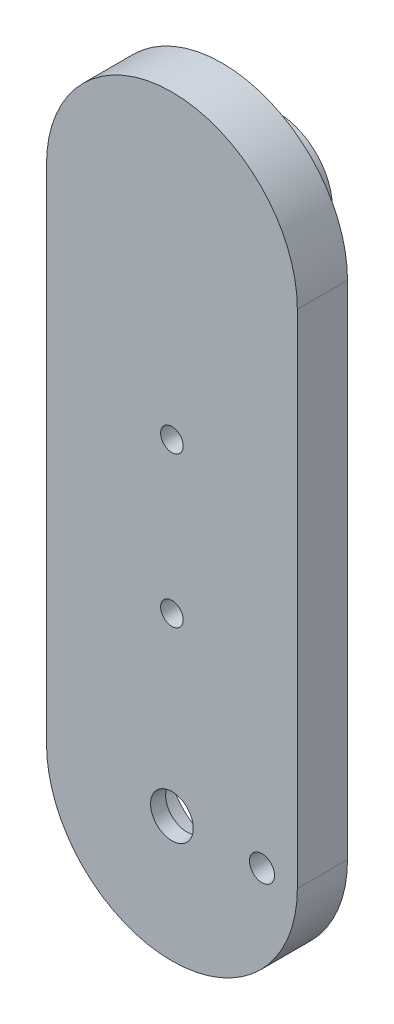
ISO-10303-21;
HEADER;
FILE_DESCRIPTION(('STEP AP214'),'2;1');
FILE_NAME('part.step','',(''),(''),'','','');
FILE_SCHEMA(('AUTOMOTIVE_DESIGN { 1 0 10303 214 1 1 1 1 }'));
ENDSEC;
DATA;
#1=APPLICATION_CONTEXT('core data for automotive mechanical design processes');
#2=APPLICATION_PROTOCOL_DEFINITION('international standard','automotive_design',2000,#1);
#3=PRODUCT_CONTEXT('',#1,'mechanical');
#4=PRODUCT('Part','Part','',(#3));
#5=PRODUCT_RELATED_PRODUCT_CATEGORY('part','',(#4));
#6=PRODUCT_DEFINITION_FORMATION('','',#4);
#7=PRODUCT_DEFINITION_CONTEXT('part definition',#1,'design');
#8=PRODUCT_DEFINITION('design','',#6,#7);
#9=PRODUCT_DEFINITION_SHAPE('','',#8);
#10=(LENGTH_UNIT() NAMED_UNIT(*) SI_UNIT(.MILLI.,.METRE.));
#11=(NAMED_UNIT(*) PLANE_ANGLE_UNIT() SI_UNIT($,.RADIAN.));
#12=(NAMED_UNIT(*) SI_UNIT($,.STERADIAN.) SOLID_ANGLE_UNIT());
#13=UNCERTAINTY_MEASURE_WITH_UNIT(LENGTH_MEASURE(1.E-05),#10,'distance_accuracy_value','');
#14=(GEOMETRIC_REPRESENTATION_CONTEXT(3) GLOBAL_UNCERTAINTY_ASSIGNED_CONTEXT((#13)) GLOBAL_UNIT_ASSIGNED_CONTEXT((#10,
#11,#12)) REPRESENTATION_CONTEXT('',''));
#15=CARTESIAN_POINT('',(0.,0.,0.));
#16=DIRECTION('',(0.,0.,1.));
#17=DIRECTION('',(1.,0.,0.));
#18=AXIS2_PLACEMENT_3D('',#15,#16,#17);
#19=CARTESIAN_POINT('',(0.,0.,5.));
#20=DIRECTION('',(0.,0.,-1.));
#21=DIRECTION('',(-1.,0.,0.));
#22=AXIS2_PLACEMENT_3D('',#19,#20,#21);
#23=CYLINDRICAL_SURFACE('',#22,11.);
#24=CARTESIAN_POINT('',(0.,11.,-2.25));
#25=CARTESIAN_POINT('',(-0.124987608206332,10.9999976894101,-2.24999547473362));
#26=CARTESIAN_POINT('',(-0.250031813618168,10.9978479272228,-2.23955021510708));
#27=CARTESIAN_POINT('',(-0.4965816567914,10.9894795224985,-2.19808072449461));
#28=CARTESIAN_POINT('',(-0.618084473376513,10.9832577238603,-2.16704053079684));
#29=CARTESIAN_POINT('',(-0.853951558981862,10.9674395297871,-2.0853834766751));
#30=CARTESIAN_POINT('',(-0.968322685371622,10.9578464367747,-2.03478576939941));
#31=CARTESIAN_POINT('',(-1.18694541264326,10.9363267475329,-1.91550781782388));
#32=CARTESIAN_POINT('',(-1.29119753484861,10.9244002716133,-1.84682850575217));
#33=CARTESIAN_POINT('',(-1.48810336078442,10.8993365405889,-1.69230825158218));
#34=CARTESIAN_POINT('',(-1.58059347100945,10.8861858654501,-1.60626099838021));
#35=CARTESIAN_POINT('',(-1.74993281237088,10.8602528012969,-1.4198907949013));
#36=CARTESIAN_POINT('',(-1.82678078295885,10.8474704420352,-1.31956669520646));
#37=CARTESIAN_POINT('',(-1.96335672247406,10.8235899485669,-1.10630615387236));
#38=CARTESIAN_POINT('',(-2.02291417693734,10.8125090655011,-0.993258408582383));
#39=CARTESIAN_POINT('',(-2.12212576817039,10.7934772316943,-0.758496098866292));
#40=CARTESIAN_POINT('',(-2.16178196715749,10.7855259566738,-0.636782433917319));
#41=CARTESIAN_POINT('',(-2.21953200261879,10.7737896127739,-0.389906884904544));
#42=CARTESIAN_POINT('',(-2.23791349245955,10.7699490186227,-0.264814983901196));
#43=CARTESIAN_POINT('',(-2.25348602933261,10.7667018443182,-0.0132683424083251));
#44=CARTESIAN_POINT('',(-2.25067934507684,10.7672947894459,0.113186250723861));
#45=CARTESIAN_POINT('',(-2.22418752053513,10.7727972914828,0.361756262662354));
#46=CARTESIAN_POINT('',(-2.20083315981161,10.7776384566947,0.483908675549217));
#47=CARTESIAN_POINT('',(-2.13443150320758,10.7909841309699,0.722524207712961));
#48=CARTESIAN_POINT('',(-2.09138322794608,10.7994888222196,0.838987043727593));
#49=CARTESIAN_POINT('',(-1.98650274323267,10.8192726117414,1.06386523301886));
#50=CARTESIAN_POINT('',(-1.92454034985609,10.8305708318069,1.1722181180589));
#51=CARTESIAN_POINT('',(-1.78368229182678,10.8546565094957,1.37711215490351));
#52=CARTESIAN_POINT('',(-1.70478459548264,10.8674441457167,1.47365188732622));
#53=CARTESIAN_POINT('',(-1.5305292169866,10.8933634351068,1.65408690161898));
#54=CARTESIAN_POINT('',(-1.43488945853772,10.9064970309,1.73770972640525));
#55=CARTESIAN_POINT('',(-1.23079974899386,10.9314081125153,1.88776969690617));
#56=CARTESIAN_POINT('',(-1.12234961883208,10.9431855793768,1.95420660235003));
#57=CARTESIAN_POINT('',(-0.895408008320709,10.9640884212837,2.06806317905267));
#58=CARTESIAN_POINT('',(-0.776899925761593,10.9732092967728,2.11545063663552));
#59=CARTESIAN_POINT('',(-0.533376321976613,10.9877373167415,2.18956691917448));
#60=CARTESIAN_POINT('',(-0.408361628133855,10.9931449321654,2.21629836393965));
#61=CARTESIAN_POINT('',(-0.157713824249075,10.9995712135856,2.24795560381119));
#62=CARTESIAN_POINT('',(-0.0321296514464416,11.0006648863546,2.25325409687552));
#63=CARTESIAN_POINT('',(0.218129471960908,10.9985488283895,2.24290026735251));
#64=CARTESIAN_POINT('',(0.342804475702921,10.9953393512174,2.22724917921333));
#65=CARTESIAN_POINT('',(0.586496202483617,10.985024643941,2.17574997889453));
#66=CARTESIAN_POINT('',(0.70555525804705,10.9779565099984,2.14009409872879));
#67=CARTESIAN_POINT('',(0.936004353214607,10.9607144170942,2.04980829192146));
#68=CARTESIAN_POINT('',(1.04739379805464,10.9505402175947,1.99517689574503));
#69=CARTESIAN_POINT('',(1.26090635939166,10.9280281215346,1.86769158103942));
#70=CARTESIAN_POINT('',(1.36289347169275,10.9156643309935,1.79461455291609));
#71=CARTESIAN_POINT('',(1.55329108640801,10.8902034029711,1.63260992526514));
#72=CARTESIAN_POINT('',(1.64170005931954,10.8771061830993,1.54368054249132));
#73=CARTESIAN_POINT('',(1.80387851970133,10.8514002190471,1.35079560302232));
#74=CARTESIAN_POINT('',(1.87739160405016,10.8388026194027,1.24662271525508));
#75=CARTESIAN_POINT('',(2.00587780786323,10.8157631505878,1.02718877092705));
#76=CARTESIAN_POINT('',(2.06085168612401,10.8053211931951,0.911928168426778));
#77=CARTESIAN_POINT('',(2.15035410407107,10.7878662903402,0.674182257824817));
#78=CARTESIAN_POINT('',(2.18499109110444,10.7808351919115,0.551739172956791));
#79=CARTESIAN_POINT('',(2.2331630323625,10.7709608861474,0.302610955868324));
#80=CARTESIAN_POINT('',(2.2467008819517,10.7681171042035,0.175926408127365));
#81=CARTESIAN_POINT('',(2.25217927138771,10.7669723424816,-0.0755118449622086));
#82=CARTESIAN_POINT('',(2.24452527407203,10.7685860758331,-0.200256503041909));
#83=CARTESIAN_POINT('',(2.2087348262925,10.7759834143784,-0.446639530735529));
#84=CARTESIAN_POINT('',(2.18059855744083,10.7817669825993,-0.56827792788214));
#85=CARTESIAN_POINT('',(2.10482673161827,10.7968133732455,-0.80472250366001));
#86=CARTESIAN_POINT('',(2.05724308574249,10.8060669278161,-0.919545946184929));
#87=CARTESIAN_POINT('',(1.94397468615884,10.8270155237707,-1.1396423265248));
#88=CARTESIAN_POINT('',(1.87828832622432,10.8387107817811,-1.24491441576027));
#89=CARTESIAN_POINT('',(1.72930364309203,10.8634845308472,-1.44493409063308));
#90=CARTESIAN_POINT('',(1.64571339460863,10.8765838900749,-1.53946169134703));
#91=CARTESIAN_POINT('',(1.46389393425321,10.9025424067376,-1.71328211363874));
#92=CARTESIAN_POINT('',(1.36566135997704,10.9154015082357,-1.79257142635859));
#93=CARTESIAN_POINT('',(1.15604167148323,10.9395982609332,-1.93449387957237));
#94=CARTESIAN_POINT('',(1.0445213268703,10.9509175518103,-1.99693351052365));
#95=CARTESIAN_POINT('',(0.812368101867732,10.9705778750018,-2.10208609060745));
#96=CARTESIAN_POINT('',(0.691743413152428,10.9789215468343,-2.1448165326652));
#97=CARTESIAN_POINT('',(0.475734657643083,10.9901003952756,-2.20121594874028));
#98=CARTESIAN_POINT('',(0.381566702172668,10.993790727549,-2.21947682427493));
#99=CARTESIAN_POINT('',(0.191610215430881,10.9987413736296,-2.24387037498906));
#100=CARTESIAN_POINT('',(0.0958217402787857,11.0000017714135,-2.25000346929513));
#101=CARTESIAN_POINT('',(0.,11.,-2.25));
#102=B_SPLINE_CURVE_WITH_KNOTS('',3,(#24,#25,#26,#27,#28,#29,#30,#31,#32,#33,#34,#35,#36,#37,
#38,#39,#40,#41,#42,#43,#44,#45,#46,#47,#48,#49,#50,#51,#52,#53,#54,#55,#56,#57,#58,#59,#60,#61,
#62,#63,#64,#65,#66,#67,#68,#69,#70,#71,#72,#73,#74,#75,#76,#77,#78,#79,#80,#81,#82,#83,#84,#85,
#86,#87,#88,#89,#90,#91,#92,#93,#94,#95,#96,#97,#98,#99,#100,#101),.UNSPECIFIED.,.T.,.F.,(4,2,2,
2,2,2,2,2,2,2,2,2,2,2,2,2,2,2,2,2,2,2,2,2,2,2,2,2,2,2,2,2,2,2,2,2,2,2,4),(0.,0.37461223356625,
0.749515161123903,1.1240518635786,1.49856925993152,1.87782932107627,2.25711993344849,
2.64003296953064,3.02290631901961,3.4005400613464,3.77813336932442,4.14975711394916,
4.52139934148146,4.89565953664907,5.26996465611624,5.65132097785948,6.03268263093399,
6.41468650194891,6.79664191532833,7.17192618317925,7.547188338484,7.91890477081495,
8.29064999667578,8.6671273197432,9.0436470198529,9.42618108999931,9.80869950139742,
10.1891591427531,10.5695665702982,10.9427462365815,11.3159225939959,11.6881092668619,
12.0603289739308,12.4391557816834,12.8180697160859,13.2011660676324,13.5839217439412,
13.8711281099734,14.1583245502059),.UNSPECIFIED.);
#103=CARTESIAN_POINT('',(0.,11.,-2.25));
#104=VERTEX_POINT('',#103);
#105=EDGE_CURVE('E177',#104,#104,#102,.T.);
#106=ORIENTED_EDGE('',*,*,#105,.F.);
#107=EDGE_LOOP('',(#106));
#108=FACE_BOUND('',#107,.T.);
#109=CARTESIAN_POINT('',(0.,0.,-5.));
#110=DIRECTION('',(0.,0.,1.));
#111=DIRECTION('',(1.,0.,0.));
#112=AXIS2_PLACEMENT_3D('',#109,#110,#111);
#113=CIRCLE('',#112,11.);
#114=CARTESIAN_POINT('',(11.,0.,-5.));
#115=VERTEX_POINT('',#114);
#116=EDGE_CURVE('E201',#115,#115,#113,.T.);
#117=ORIENTED_EDGE('',*,*,#116,.T.);
#118=EDGE_LOOP('',(#117));
#119=FACE_BOUND('',#118,.T.);
#120=CARTESIAN_POINT('',(0.,0.,6.));
#121=DIRECTION('',(0.,0.,1.));
#122=DIRECTION('',(1.,0.,0.));
#123=AXIS2_PLACEMENT_3D('',#120,#121,#122);
#124=CIRCLE('',#123,11.);
#125=CARTESIAN_POINT('',(11.,0.,6.));
#126=VERTEX_POINT('',#125);
#127=EDGE_CURVE('E11',#126,#126,#124,.T.);
#128=ORIENTED_EDGE('',*,*,#127,.F.);
#129=EDGE_LOOP('',(#128));
#130=FACE_BOUND('',#129,.T.);
#131=ADVANCED_FACE('F39',(#108,#119,#130),#23,.T.);
#132=CARTESIAN_POINT('',(0.,0.,5.));
#133=DIRECTION('',(0.,0.,-1.));
#134=DIRECTION('',(-1.,0.,0.));
#135=AXIS2_PLACEMENT_3D('',#132,#133,#134);
#136=CYLINDRICAL_SURFACE('',#135,3.1);
#137=DIRECTION('',(0.,0.,-1.));
#138=VECTOR('',#137,1.);
#139=CARTESIAN_POINT('',(-1.83303027798234,2.5,5.));
#140=LINE('',#139,#138);
#141=CARTESIAN_POINT('',(-1.83303027798234,2.5,-1.30479883506999));
#142=VERTEX_POINT('',#141);
#143=CARTESIAN_POINT('',(-1.83303027798234,2.5,-5.));
#144=VERTEX_POINT('',#143);
#145=EDGE_CURVE('E189',#142,#144,#140,.T.);
#146=ORIENTED_EDGE('',*,*,#145,.F.);
#147=CARTESIAN_POINT('',(-1.83303027798234,2.5,-1.30479883506999));
#148=CARTESIAN_POINT('',(-1.86470626813592,2.47677763485356,-1.26028157910569));
#149=CARTESIAN_POINT('',(-1.89481556700698,2.45377147589371,-1.214567481988));
#150=CARTESIAN_POINT('',(-1.95183424303017,2.40866466730363,-1.12065954838441));
#151=CARTESIAN_POINT('',(-1.97873908587669,2.38656532912035,-1.07246233315638));
#152=CARTESIAN_POINT('',(-2.05495365259588,2.32198480729672,-0.923163435206452));
#153=CARTESIAN_POINT('',(-2.09908718400533,2.2817347156289,-0.818295850085372));
#154=CARTESIAN_POINT('',(-2.16443011816865,2.21965504144289,-0.621479043886192));
#155=CARTESIAN_POINT('',(-2.18845657946295,2.19575243317431,-0.531127565624099));
#156=CARTESIAN_POINT('',(-2.22515395568232,2.15856059263126,-0.346393107468627));
#157=CARTESIAN_POINT('',(-2.23788234035652,2.1452176845517,-0.252033119167112));
#158=CARTESIAN_POINT('',(-2.25123223599405,2.13121196711096,-0.0607776570080386));
#159=CARTESIAN_POINT('',(-2.25176563295208,2.13064144431452,0.0361312079282121));
#160=CARTESIAN_POINT('',(-2.24044477324092,2.14253601676988,0.228530378604305));
#161=CARTESIAN_POINT('',(-2.22856739183459,2.155025446383,0.324017698799983));
#162=CARTESIAN_POINT('',(-2.19077008868224,2.1934760182532,0.52430690746162));
#163=CARTESIAN_POINT('',(-2.16304839464007,2.22114220928698,0.628424969290037));
#164=CARTESIAN_POINT('',(-2.09437148712518,2.28600498857198,0.829098994194227));
#165=CARTESIAN_POINT('',(-2.05339053778167,2.32322008168312,0.925639793461529));
#166=CARTESIAN_POINT('',(-1.98095086503942,2.38473649331686,1.06842557414586));
#167=CARTESIAN_POINT('',(-1.95360624908354,2.407237300777,1.11761924514944));
#168=CARTESIAN_POINT('',(-1.89570770904669,2.45309006115265,1.21321371017028));
#169=CARTESIAN_POINT('',(-1.86517331954822,2.4764363202695,1.25962904845425));
#170=CARTESIAN_POINT('',(-1.83303027798234,2.5,1.30479883506999));
#171=B_SPLINE_CURVE_WITH_KNOTS('',3,(#147,#148,#149,#150,#151,#152,#153,#154,#155,#156,#157,
#158,#159,#160,#161,#162,#163,#164,#165,#166,#167,#168,#169,#170),.UNSPECIFIED.,.F.,.F.,(4,2,2,
2,2,2,2,2,2,2,2,4),(0.,0.178014377291526,0.356277725428494,0.716574603227641,1.00497730383374,
1.29190444200527,1.58090410146075,1.87044320964988,2.20238487123558,2.53497472747496,
2.71668453874547,2.89734039588229),.UNSPECIFIED.);
#172=CARTESIAN_POINT('',(-1.83303027798234,2.5,1.30479883506999));
#173=VERTEX_POINT('',#172);
#174=EDGE_CURVE('E158',#142,#173,#171,.T.);
#175=ORIENTED_EDGE('',*,*,#174,.T.);
#176=CARTESIAN_POINT('',(-1.83303027798234,2.5,5.));
#177=VERTEX_POINT('',#176);
#178=EDGE_CURVE('E194',#177,#173,#140,.T.);
#179=ORIENTED_EDGE('',*,*,#178,.F.);
#180=CARTESIAN_POINT('',(0.,0.,5.));
#181=DIRECTION('',(0.,0.,1.));
#182=DIRECTION('',(1.,0.,0.));
#183=AXIS2_PLACEMENT_3D('',#180,#181,#182);
#184=CIRCLE('',#183,3.1);
#185=CARTESIAN_POINT('',(1.83303027798234,2.5,5.));
#186=VERTEX_POINT('',#185);
#187=EDGE_CURVE('E184',#177,#186,#184,.T.);
#188=ORIENTED_EDGE('',*,*,#187,.T.);
#189=DIRECTION('',(0.,0.,-1.));
#190=VECTOR('',#189,1.);
#191=CARTESIAN_POINT('',(1.83303027798234,2.5,5.));
#192=LINE('',#191,#190);
#193=CARTESIAN_POINT('',(1.83303027798234,2.5,1.30479883506999));
#194=VERTEX_POINT('',#193);
#195=EDGE_CURVE('E198',#186,#194,#192,.T.);
#196=ORIENTED_EDGE('',*,*,#195,.T.);
#197=CARTESIAN_POINT('',(1.83303027798234,2.5,1.30479883506999));
#198=CARTESIAN_POINT('',(1.86470626813592,2.47677763485356,1.26028157910569));
#199=CARTESIAN_POINT('',(1.89481556700698,2.45377147589371,1.214567481988));
#200=CARTESIAN_POINT('',(1.95183424303017,2.40866466730363,1.12065954838441));
#201=CARTESIAN_POINT('',(1.97873908587668,2.38656532912035,1.07246233315638));
#202=CARTESIAN_POINT('',(2.05495365259588,2.32198480729672,0.923163435206453));
#203=CARTESIAN_POINT('',(2.09908718400533,2.2817347156289,0.818295850085372));
#204=CARTESIAN_POINT('',(2.16443011816866,2.21965504144289,0.621479043886193));
#205=CARTESIAN_POINT('',(2.18845657946295,2.19575243317431,0.531127565624099));
#206=CARTESIAN_POINT('',(2.22515395568232,2.15856059263126,0.346393107468627));
#207=CARTESIAN_POINT('',(2.23788234035652,2.1452176845517,0.252033119167113));
#208=CARTESIAN_POINT('',(2.25123223599405,2.13121196711096,0.0607776570080388));
#209=CARTESIAN_POINT('',(2.25176563295208,2.13064144431452,-0.036131207928212));
#210=CARTESIAN_POINT('',(2.24044477324092,2.14253601676988,-0.228530378604305));
#211=CARTESIAN_POINT('',(2.22856739183459,2.15502544638299,-0.324017698799983));
#212=CARTESIAN_POINT('',(2.19077008868225,2.1934760182532,-0.52430690746162));
#213=CARTESIAN_POINT('',(2.16304839464007,2.22114220928697,-0.628424969290037));
#214=CARTESIAN_POINT('',(2.09437148712518,2.28600498857198,-0.829098994194227));
#215=CARTESIAN_POINT('',(2.05339053778167,2.32322008168312,-0.925639793461528));
#216=CARTESIAN_POINT('',(1.98095086503942,2.38473649331685,-1.06842557414586));
#217=CARTESIAN_POINT('',(1.95360624908354,2.407237300777,-1.11761924514944));
#218=CARTESIAN_POINT('',(1.89570770904669,2.45309006115265,-1.21321371017028));
#219=CARTESIAN_POINT('',(1.86517331954822,2.4764363202695,-1.25962904845426));
#220=CARTESIAN_POINT('',(1.83303027798234,2.5,-1.30479883506999));
#221=B_SPLINE_CURVE_WITH_KNOTS('',3,(#197,#198,#199,#200,#201,#202,#203,#204,#205,#206,#207,
#208,#209,#210,#211,#212,#213,#214,#215,#216,#217,#218,#219,#220),.UNSPECIFIED.,.F.,.F.,(4,2,2,
2,2,2,2,2,2,2,2,4),(0.,0.178014377291526,0.356277725428495,0.716574603227641,1.00497730383374,
1.29190444200527,1.58090410146075,1.87044320964989,2.20238487123558,2.53497472747496,
2.71668453874547,2.8973403958823),.UNSPECIFIED.);
#222=CARTESIAN_POINT('',(1.83303027798234,2.5,-1.30479883506999));
#223=VERTEX_POINT('',#222);
#224=EDGE_CURVE('E56',#194,#223,#221,.T.);
#225=ORIENTED_EDGE('',*,*,#224,.T.);
#226=CARTESIAN_POINT('',(1.83303027798234,2.5,-5.));
#227=VERTEX_POINT('',#226);
#228=EDGE_CURVE('E197',#223,#227,#192,.T.);
#229=ORIENTED_EDGE('',*,*,#228,.T.);
#230=CARTESIAN_POINT('',(0.,0.,-5.));
#231=DIRECTION('',(0.,0.,1.));
#232=DIRECTION('',(1.,0.,0.));
#233=AXIS2_PLACEMENT_3D('',#230,#231,#232);
#234=CIRCLE('',#233,3.1);
#235=EDGE_CURVE('E183',#144,#227,#234,.T.);
#236=ORIENTED_EDGE('',*,*,#235,.F.);
#237=EDGE_LOOP('',(#146,#175,#179,#188,#196,#225,#229,#236));
#238=FACE_BOUND('',#237,.T.);
#239=ADVANCED_FACE('F164',(#238),#136,.F.);
#240=CARTESIAN_POINT('',(1.83303027798234,2.5,5.));
#241=DIRECTION('',(0.,-1.,0.));
#242=DIRECTION('',(1.,0.,0.));
#243=AXIS2_PLACEMENT_3D('',#240,#241,#242);
#244=PLANE('',#243);
#245=ORIENTED_EDGE('',*,*,#228,.F.);
#246=CARTESIAN_POINT('',(0.,2.5,0.));
#247=DIRECTION('',(0.,-1.,0.));
#248=DIRECTION('',(1.,0.,0.));
#249=AXIS2_PLACEMENT_3D('',#246,#247,#248);
#250=CIRCLE('',#249,2.25);
#251=EDGE_CURVE('E48',#223,#142,#250,.F.);
#252=ORIENTED_EDGE('',*,*,#251,.T.);
#253=ORIENTED_EDGE('',*,*,#145,.T.);
#254=DIRECTION('',(-1.,0.,0.));
#255=VECTOR('',#254,1.);
#256=CARTESIAN_POINT('',(1.83303027798234,2.5,-5.));
#257=LINE('',#256,#255);
#258=EDGE_CURVE('E187',#227,#144,#257,.T.);
#259=ORIENTED_EDGE('',*,*,#258,.F.);
#260=EDGE_LOOP('',(#245,#252,#253,#259));
#261=FACE_BOUND('',#260,.T.);
#262=ADVANCED_FACE('F256',(#261),#244,.T.);
#263=CARTESIAN_POINT('',(0.,0.,-5.));
#264=DIRECTION('',(0.,0.,1.));
#265=DIRECTION('',(1.,0.,0.));
#266=AXIS2_PLACEMENT_3D('',#263,#264,#265);
#267=PLANE('',#266);
#268=ORIENTED_EDGE('',*,*,#116,.F.);
#269=EDGE_LOOP('',(#268));
#270=FACE_BOUND('',#269,.T.);
#271=ORIENTED_EDGE('',*,*,#235,.T.);
#272=ORIENTED_EDGE('',*,*,#258,.T.);
#273=EDGE_LOOP('',(#271,#272));
#274=FACE_BOUND('',#273,.T.);
#275=ADVANCED_FACE('F401',(#270,#274),#267,.F.);
#276=ORIENTED_EDGE('',*,*,#178,.T.);
#277=EDGE_CURVE('E204',#173,#194,#250,.F.);
#278=ORIENTED_EDGE('',*,*,#277,.T.);
#279=ORIENTED_EDGE('',*,*,#195,.F.);
#280=DIRECTION('',(-1.,0.,0.));
#281=VECTOR('',#280,1.);
#282=CARTESIAN_POINT('',(1.83303027798234,2.5,5.));
#283=LINE('',#282,#281);
#284=EDGE_CURVE('E63',#186,#177,#283,.T.);
#285=ORIENTED_EDGE('',*,*,#284,.T.);
#286=EDGE_LOOP('',(#276,#278,#279,#285));
#287=FACE_BOUND('',#286,.T.);
#288=ADVANCED_FACE('F403',(#287),#244,.T.);
#289=CARTESIAN_POINT('',(0.,0.,5.));
#290=DIRECTION('',(0.,0.,1.));
#291=DIRECTION('',(1.,0.,0.));
#292=AXIS2_PLACEMENT_3D('',#289,#290,#291);
#293=PLANE('',#292);
#294=ORIENTED_EDGE('',*,*,#284,.F.);
#295=ORIENTED_EDGE('',*,*,#187,.F.);
#296=EDGE_LOOP('',(#294,#295));
#297=FACE_BOUND('',#296,.T.);
#298=ADVANCED_FACE('F173',(#297),#293,.F.);
#299=CARTESIAN_POINT('',(0.,11.,0.));
#300=DIRECTION('',(0.,-1.,0.));
#301=DIRECTION('',(0.,0.,-1.));
#302=AXIS2_PLACEMENT_3D('',#299,#300,#301);
#303=CYLINDRICAL_SURFACE('',#302,2.25);
#304=ORIENTED_EDGE('',*,*,#224,.F.);
#305=ORIENTED_EDGE('',*,*,#277,.F.);
#306=ORIENTED_EDGE('',*,*,#174,.F.);
#307=ORIENTED_EDGE('',*,*,#251,.F.);
#308=EDGE_LOOP('',(#304,#305,#306,#307));
#309=FACE_BOUND('',#308,.T.);
#310=ORIENTED_EDGE('',*,*,#105,.T.);
#311=EDGE_LOOP('',(#310));
#312=FACE_BOUND('',#311,.T.);
#313=ADVANCED_FACE('F167',(#309,#312),#303,.F.);
#314=CARTESIAN_POINT('',(0.,0.,16.));
#315=DIRECTION('',(0.,0.,-1.));
#316=DIRECTION('',(-1.,0.,0.));
#317=AXIS2_PLACEMENT_3D('',#314,#315,#316);
#318=CYLINDRICAL_SURFACE('',#317,25.);
#319=DIRECTION('',(0.,0.,-1.));
#320=VECTOR('',#319,1.);
#321=CARTESIAN_POINT('',(25.,0.,16.));
#322=LINE('',#321,#320);
#323=CARTESIAN_POINT('',(25.,0.,16.));
#324=VERTEX_POINT('',#323);
#325=CARTESIAN_POINT('',(25.,0.,6.));
#326=VERTEX_POINT('',#325);
#327=EDGE_CURVE('E111',#324,#326,#322,.T.);
#328=ORIENTED_EDGE('',*,*,#327,.T.);
#329=CARTESIAN_POINT('',(0.,0.,6.));
#330=DIRECTION('',(0.,0.,1.));
#331=DIRECTION('',(1.,0.,0.));
#332=AXIS2_PLACEMENT_3D('',#329,#330,#331);
#333=CIRCLE('',#332,25.);
#334=CARTESIAN_POINT('',(-25.,0.,6.));
#335=VERTEX_POINT('',#334);
#336=EDGE_CURVE('E138',#326,#335,#333,.T.);
#337=ORIENTED_EDGE('',*,*,#336,.T.);
#338=DIRECTION('',(0.,0.,-1.));
#339=VECTOR('',#338,1.);
#340=CARTESIAN_POINT('',(-25.,0.,16.));
#341=LINE('',#340,#339);
#342=CARTESIAN_POINT('',(-25.,0.,16.));
#343=VERTEX_POINT('',#342);
#344=EDGE_CURVE('E149',#343,#335,#341,.T.);
#345=ORIENTED_EDGE('',*,*,#344,.F.);
#346=CARTESIAN_POINT('',(0.,0.,16.));
#347=DIRECTION('',(0.,0.,1.));
#348=DIRECTION('',(1.,0.,0.));
#349=AXIS2_PLACEMENT_3D('',#346,#347,#348);
#350=CIRCLE('',#349,25.);
#351=EDGE_CURVE('E145',#324,#343,#350,.T.);
#352=ORIENTED_EDGE('',*,*,#351,.F.);
#353=EDGE_LOOP('',(#328,#337,#345,#352));
#354=FACE_BOUND('',#353,.T.);
#355=ADVANCED_FACE('F172',(#354),#318,.T.);
#356=CARTESIAN_POINT('',(-25.,0.,16.));
#357=DIRECTION('',(1.,0.,0.));
#358=DIRECTION('',(0.,1.,0.));
#359=AXIS2_PLACEMENT_3D('',#356,#357,#358);
#360=PLANE('',#359);
#361=ORIENTED_EDGE('',*,*,#344,.T.);
#362=DIRECTION('',(0.,-1.,0.));
#363=VECTOR('',#362,1.);
#364=CARTESIAN_POINT('',(-25.,0.,6.));
#365=LINE('',#364,#363);
#366=CARTESIAN_POINT('',(-25.,-100.,6.00000000000001));
#367=VERTEX_POINT('',#366);
#368=EDGE_CURVE('E141',#335,#367,#365,.T.);
#369=ORIENTED_EDGE('',*,*,#368,.T.);
#370=DIRECTION('',(0.,0.,1.));
#371=VECTOR('',#370,1.);
#372=CARTESIAN_POINT('',(-25.,-100.,-58.0312423743285));
#373=LINE('',#372,#371);
#374=CARTESIAN_POINT('',(-25.,-100.,16.));
#375=VERTEX_POINT('',#374);
#376=EDGE_CURVE('E126',#367,#375,#373,.T.);
#377=ORIENTED_EDGE('',*,*,#376,.T.);
#378=DIRECTION('',(0.,-1.,0.));
#379=VECTOR('',#378,1.);
#380=CARTESIAN_POINT('',(-25.,0.,16.));
#381=LINE('',#380,#379);
#382=EDGE_CURVE('E116',#343,#375,#381,.T.);
#383=ORIENTED_EDGE('',*,*,#382,.F.);
#384=EDGE_LOOP('',(#361,#369,#377,#383));
#385=FACE_BOUND('',#384,.T.);
#386=ADVANCED_FACE('F271',(#385),#360,.F.);
#387=CARTESIAN_POINT('',(25.,-85.,16.));
#388=DIRECTION('',(-1.,0.,0.));
#389=DIRECTION('',(0.,-1.,0.));
#390=AXIS2_PLACEMENT_3D('',#387,#388,#389);
#391=PLANE('',#390);
#392=DIRECTION('',(0.,1.,0.));
#393=VECTOR('',#392,1.);
#394=CARTESIAN_POINT('',(25.,-85.,16.));
#395=LINE('',#394,#393);
#396=CARTESIAN_POINT('',(25.,-100.,16.));
#397=VERTEX_POINT('',#396);
#398=EDGE_CURVE('E106',#397,#324,#395,.T.);
#399=ORIENTED_EDGE('',*,*,#398,.F.);
#400=DIRECTION('',(0.,0.,1.));
#401=VECTOR('',#400,1.);
#402=CARTESIAN_POINT('',(25.,-100.,-58.0312423743285));
#403=LINE('',#402,#401);
#404=CARTESIAN_POINT('',(25.,-100.,6.00000000000001));
#405=VERTEX_POINT('',#404);
#406=EDGE_CURVE('E110',#405,#397,#403,.T.);
#407=ORIENTED_EDGE('',*,*,#406,.F.);
#408=DIRECTION('',(0.,1.,0.));
#409=VECTOR('',#408,1.);
#410=CARTESIAN_POINT('',(25.,-85.,6.));
#411=LINE('',#410,#409);
#412=EDGE_CURVE('E143',#405,#326,#411,.T.);
#413=ORIENTED_EDGE('',*,*,#412,.T.);
#414=ORIENTED_EDGE('',*,*,#327,.F.);
#415=EDGE_LOOP('',(#399,#407,#413,#414));
#416=FACE_BOUND('',#415,.T.);
#417=ADVANCED_FACE('F108',(#416),#391,.F.);
#418=CARTESIAN_POINT('',(0.,0.,16.));
#419=DIRECTION('',(0.,0.,1.));
#420=DIRECTION('',(1.,0.,0.));
#421=AXIS2_PLACEMENT_3D('',#418,#419,#420);
#422=PLANE('',#421);
#423=CARTESIAN_POINT('',(17.95,-100.,16.));
#424=DIRECTION('',(0.,0.,1.));
#425=DIRECTION('',(1.,0.,0.));
#426=AXIS2_PLACEMENT_3D('',#423,#424,#425);
#427=CIRCLE('',#426,2.5);
#428=CARTESIAN_POINT('',(20.45,-100.,16.));
#429=VERTEX_POINT('',#428);
#430=EDGE_CURVE('E229',#429,#429,#427,.T.);
#431=ORIENTED_EDGE('',*,*,#430,.F.);
#432=EDGE_LOOP('',(#431));
#433=FACE_BOUND('',#432,.T.);
#434=CARTESIAN_POINT('',(0.,-100.,16.));
#435=DIRECTION('',(0.,0.,-1.));
#436=DIRECTION('',(-1.,0.,0.));
#437=AXIS2_PLACEMENT_3D('',#434,#435,#436);
#438=CIRCLE('',#437,4.25);
#439=CARTESIAN_POINT('',(-4.24999999999999,-100.,16.));
#440=VERTEX_POINT('',#439);
#441=EDGE_CURVE('E221',#440,#440,#438,.T.);
#442=ORIENTED_EDGE('',*,*,#441,.T.);
#443=EDGE_LOOP('',(#442));
#444=FACE_BOUND('',#443,.T.);
#445=CARTESIAN_POINT('',(0.,-35.,16.));
#446=DIRECTION('',(0.,0.,1.));
#447=DIRECTION('',(1.,0.,0.));
#448=AXIS2_PLACEMENT_3D('',#445,#446,#447);
#449=CIRCLE('',#448,2.25);
#450=CARTESIAN_POINT('',(2.25,-35.,16.));
#451=VERTEX_POINT('',#450);
#452=EDGE_CURVE('E207',#451,#451,#449,.T.);
#453=ORIENTED_EDGE('',*,*,#452,.F.);
#454=EDGE_LOOP('',(#453));
#455=FACE_BOUND('',#454,.T.);
#456=CARTESIAN_POINT('',(0.,-65.,16.));
#457=DIRECTION('',(0.,0.,1.));
#458=DIRECTION('',(1.,0.,0.));
#459=AXIS2_PLACEMENT_3D('',#456,#457,#458);
#460=CIRCLE('',#459,2.25);
#461=CARTESIAN_POINT('',(2.25,-65.,16.));
#462=VERTEX_POINT('',#461);
#463=EDGE_CURVE('E211',#462,#462,#460,.T.);
#464=ORIENTED_EDGE('',*,*,#463,.F.);
#465=EDGE_LOOP('',(#464));
#466=FACE_BOUND('',#465,.T.);
#467=ORIENTED_EDGE('',*,*,#351,.T.);
#468=ORIENTED_EDGE('',*,*,#382,.T.);
#469=CARTESIAN_POINT('',(0.,-100.,16.));
#470=DIRECTION('',(0.,0.,1.));
#471=DIRECTION('',(1.,0.,0.));
#472=AXIS2_PLACEMENT_3D('',#469,#470,#471);
#473=CIRCLE('',#472,25.);
#474=EDGE_CURVE('E123',#375,#397,#473,.T.);
#475=ORIENTED_EDGE('',*,*,#474,.T.);
#476=ORIENTED_EDGE('',*,*,#398,.T.);
#477=EDGE_LOOP('',(#467,#468,#475,#476));
#478=FACE_BOUND('',#477,.T.);
#479=ADVANCED_FACE('F128',(#433,#444,#455,#466,#478),#422,.T.);
#480=CARTESIAN_POINT('',(0.,0.,6.));
#481=DIRECTION('',(0.,0.,1.));
#482=DIRECTION('',(1.,0.,0.));
#483=AXIS2_PLACEMENT_3D('',#480,#481,#482);
#484=PLANE('',#483);
#485=CARTESIAN_POINT('',(17.95,-100.,6.));
#486=DIRECTION('',(0.,0.,1.));
#487=DIRECTION('',(1.,0.,0.));
#488=AXIS2_PLACEMENT_3D('',#485,#486,#487);
#489=CIRCLE('',#488,2.5);
#490=CARTESIAN_POINT('',(20.45,-100.,6.));
#491=VERTEX_POINT('',#490);
#492=EDGE_CURVE('E43',#491,#491,#489,.T.);
#493=ORIENTED_EDGE('',*,*,#492,.T.);
#494=EDGE_LOOP('',(#493));
#495=FACE_BOUND('',#494,.T.);
#496=CARTESIAN_POINT('',(0.,-100.,6.));
#497=DIRECTION('',(0.,0.,-1.));
#498=DIRECTION('',(-1.,0.,0.));
#499=AXIS2_PLACEMENT_3D('',#496,#497,#498);
#500=CIRCLE('',#499,10.9);
#501=CARTESIAN_POINT('',(-10.9,-100.,6.));
#502=VERTEX_POINT('',#501);
#503=EDGE_CURVE('E218',#502,#502,#500,.T.);
#504=ORIENTED_EDGE('',*,*,#503,.F.);
#505=EDGE_LOOP('',(#504));
#506=FACE_BOUND('',#505,.T.);
#507=CARTESIAN_POINT('',(0.,-35.,6.));
#508=DIRECTION('',(0.,0.,1.));
#509=DIRECTION('',(1.,0.,0.));
#510=AXIS2_PLACEMENT_3D('',#507,#508,#509);
#511=CIRCLE('',#510,2.25);
#512=CARTESIAN_POINT('',(2.25,-35.,6.));
#513=VERTEX_POINT('',#512);
#514=EDGE_CURVE('E130',#513,#513,#511,.T.);
#515=ORIENTED_EDGE('',*,*,#514,.T.);
#516=EDGE_LOOP('',(#515));
#517=FACE_BOUND('',#516,.T.);
#518=CARTESIAN_POINT('',(0.,-65.,6.));
#519=DIRECTION('',(0.,0.,1.));
#520=DIRECTION('',(1.,0.,0.));
#521=AXIS2_PLACEMENT_3D('',#518,#519,#520);
#522=CIRCLE('',#521,2.25);
#523=CARTESIAN_POINT('',(2.25,-65.,6.));
#524=VERTEX_POINT('',#523);
#525=EDGE_CURVE('E133',#524,#524,#522,.T.);
#526=ORIENTED_EDGE('',*,*,#525,.T.);
#527=EDGE_LOOP('',(#526));
#528=FACE_BOUND('',#527,.T.);
#529=ORIENTED_EDGE('',*,*,#127,.T.);
#530=EDGE_LOOP('',(#529));
#531=FACE_BOUND('',#530,.T.);
#532=ORIENTED_EDGE('',*,*,#336,.F.);
#533=ORIENTED_EDGE('',*,*,#412,.F.);
#534=CARTESIAN_POINT('',(0.,-100.,6.00000000000001));
#535=DIRECTION('',(0.,0.,1.));
#536=DIRECTION('',(1.,0.,0.));
#537=AXIS2_PLACEMENT_3D('',#534,#535,#536);
#538=CIRCLE('',#537,25.);
#539=EDGE_CURVE('E125',#405,#367,#538,.F.);
#540=ORIENTED_EDGE('',*,*,#539,.T.);
#541=ORIENTED_EDGE('',*,*,#368,.F.);
#542=EDGE_LOOP('',(#532,#533,#540,#541));
#543=FACE_BOUND('',#542,.T.);
#544=ADVANCED_FACE('F236',(#495,#506,#517,#528,#531,#543),#484,.F.);
#545=CARTESIAN_POINT('',(0.,-100.,-58.0312423743285));
#546=DIRECTION('',(0.,0.,1.));
#547=DIRECTION('',(1.,0.,0.));
#548=AXIS2_PLACEMENT_3D('',#545,#546,#547);
#549=CYLINDRICAL_SURFACE('',#548,25.);
#550=ORIENTED_EDGE('',*,*,#539,.F.);
#551=ORIENTED_EDGE('',*,*,#406,.T.);
#552=ORIENTED_EDGE('',*,*,#474,.F.);
#553=ORIENTED_EDGE('',*,*,#376,.F.);
#554=EDGE_LOOP('',(#550,#551,#552,#553));
#555=FACE_BOUND('',#554,.T.);
#556=ADVANCED_FACE('F121',(#555),#549,.T.);
#557=CARTESIAN_POINT('',(0.,-65.,-5.));
#558=DIRECTION('',(0.,0.,1.));
#559=DIRECTION('',(1.,0.,0.));
#560=AXIS2_PLACEMENT_3D('',#557,#558,#559);
#561=CYLINDRICAL_SURFACE('',#560,2.25);
#562=CARTESIAN_POINT('',(2.25,-65.,16.));
#563=CARTESIAN_POINT('',(2.25,-65.,15.8958333333333));
#564=CARTESIAN_POINT('',(2.25,-65.,15.7916666666667));
#565=CARTESIAN_POINT('',(2.25,-65.,15.5833333333333));
#566=CARTESIAN_POINT('',(2.25,-65.,15.4791666666667));
#567=CARTESIAN_POINT('',(2.25,-65.,15.2708333333333));
#568=CARTESIAN_POINT('',(2.25,-65.,15.1666666666667));
#569=CARTESIAN_POINT('',(2.25,-65.,14.9583333333333));
#570=CARTESIAN_POINT('',(2.25,-65.,14.8541666666667));
#571=CARTESIAN_POINT('',(2.25,-65.,14.6458333333333));
#572=CARTESIAN_POINT('',(2.25,-65.,14.5416666666667));
#573=CARTESIAN_POINT('',(2.25,-65.,14.3333333333333));
#574=CARTESIAN_POINT('',(2.25,-65.,14.2291666666667));
#575=CARTESIAN_POINT('',(2.25,-65.,14.0208333333333));
#576=CARTESIAN_POINT('',(2.25,-65.,13.9166666666667));
#577=CARTESIAN_POINT('',(2.25,-65.,13.7083333333333));
#578=CARTESIAN_POINT('',(2.25,-65.,13.6041666666667));
#579=CARTESIAN_POINT('',(2.25,-65.,13.3958333333333));
#580=CARTESIAN_POINT('',(2.25,-65.,13.2916666666667));
#581=CARTESIAN_POINT('',(2.25,-65.,13.0833333333333));
#582=CARTESIAN_POINT('',(2.25,-65.,12.9791666666667));
#583=CARTESIAN_POINT('',(2.25,-65.,12.7708333333333));
#584=CARTESIAN_POINT('',(2.25,-65.,12.6666666666667));
#585=CARTESIAN_POINT('',(2.25,-65.,12.4583333333333));
#586=CARTESIAN_POINT('',(2.25,-65.,12.3541666666667));
#587=CARTESIAN_POINT('',(2.25,-65.,12.1458333333333));
#588=CARTESIAN_POINT('',(2.25,-65.,12.0416666666667));
#589=CARTESIAN_POINT('',(2.25,-65.,11.8333333333333));
#590=CARTESIAN_POINT('',(2.25,-65.,11.7291666666667));
#591=CARTESIAN_POINT('',(2.25,-65.,11.5208333333333));
#592=CARTESIAN_POINT('',(2.25,-65.,11.4166666666667));
#593=CARTESIAN_POINT('',(2.25,-65.,11.2083333333333));
#594=CARTESIAN_POINT('',(2.25,-65.,11.1041666666667));
#595=CARTESIAN_POINT('',(2.25,-65.,10.8958333333333));
#596=CARTESIAN_POINT('',(2.25,-65.,10.7916666666667));
#597=CARTESIAN_POINT('',(2.25,-65.,10.5833333333333));
#598=CARTESIAN_POINT('',(2.25,-65.,10.4791666666667));
#599=CARTESIAN_POINT('',(2.25,-65.,10.2708333333333));
#600=CARTESIAN_POINT('',(2.25,-65.,10.1666666666667));
#601=CARTESIAN_POINT('',(2.25,-65.,9.95833333333333));
#602=CARTESIAN_POINT('',(2.25,-65.,9.85416666666667));
#603=CARTESIAN_POINT('',(2.25,-65.,9.64583333333333));
#604=CARTESIAN_POINT('',(2.25,-65.,9.54166666666667));
#605=CARTESIAN_POINT('',(2.25,-65.,9.33333333333333));
#606=CARTESIAN_POINT('',(2.25,-65.,9.22916666666667));
#607=CARTESIAN_POINT('',(2.25,-65.,9.02083333333333));
#608=CARTESIAN_POINT('',(2.25,-65.,8.91666666666667));
#609=CARTESIAN_POINT('',(2.25,-65.,8.70833333333333));
#610=CARTESIAN_POINT('',(2.25,-65.,8.60416666666667));
#611=CARTESIAN_POINT('',(2.25,-65.,8.39583333333333));
#612=CARTESIAN_POINT('',(2.25,-65.,8.29166666666667));
#613=CARTESIAN_POINT('',(2.25,-65.,8.08333333333333));
#614=CARTESIAN_POINT('',(2.25,-65.,7.97916666666667));
#615=CARTESIAN_POINT('',(2.25,-65.,7.77083333333333));
#616=CARTESIAN_POINT('',(2.25,-65.,7.66666666666666));
#617=CARTESIAN_POINT('',(2.25,-65.,7.45833333333333));
#618=CARTESIAN_POINT('',(2.25,-65.,7.35416666666666));
#619=CARTESIAN_POINT('',(2.25,-65.,7.14583333333333));
#620=CARTESIAN_POINT('',(2.25,-65.,7.04166666666666));
#621=CARTESIAN_POINT('',(2.25,-65.,6.83333333333333));
#622=CARTESIAN_POINT('',(2.25,-65.,6.72916666666666));
#623=CARTESIAN_POINT('',(2.25,-65.,6.52083333333333));
#624=CARTESIAN_POINT('',(2.25,-65.,6.41666666666666));
#625=CARTESIAN_POINT('',(2.25,-65.,6.20833333333333));
#626=CARTESIAN_POINT('',(2.25,-65.,6.10416666666666));
#627=CARTESIAN_POINT('',(2.25,-65.,6.));
#628=B_SPLINE_CURVE_WITH_KNOTS('',3,(#562,#563,#564,#565,#566,#567,#568,#569,#570,#571,#572,
#573,#574,#575,#576,#577,#578,#579,#580,#581,#582,#583,#584,#585,#586,#587,#588,#589,#590,#591,
#592,#593,#594,#595,#596,#597,#598,#599,#600,#601,#602,#603,#604,#605,#606,#607,#608,#609,#610,
#611,#612,#613,#614,#615,#616,#617,#618,#619,#620,#621,#622,#623,#624,#625,#626,#627),
.UNSPECIFIED.,.F.,.F.,(4,2,2,2,2,2,2,2,2,2,2,2,2,2,2,2,2,2,2,2,2,2,2,2,2,2,2,2,2,2,2,2,4),(0.,
0.3125,0.625000000000001,0.937500000000001,1.25,1.5625,1.875,2.1875,2.5,2.8125,3.125,3.4375,
3.75,4.0625,4.375,4.6875,5.,5.3125,5.625,5.9375,6.25,6.5625,6.875,7.1875,7.5,7.8125,8.125,
8.4375,8.75,9.0625,9.375,9.6875,10.),.UNSPECIFIED.);
#629=EDGE_CURVE('BSEAM283',#462,#524,#628,.T.);
#630=ORIENTED_EDGE('',*,*,#463,.T.);
#631=ORIENTED_EDGE('',*,*,#525,.F.);
#632=ORIENTED_EDGE('',*,*,#629,.T.);
#633=ORIENTED_EDGE('',*,*,#629,.F.);
#634=EDGE_LOOP('',(#630,#632,#631,#633));
#635=FACE_BOUND('',#634,.T.);
#636=ADVANCED_FACE('F283',(#635),#561,.F.);
#637=CARTESIAN_POINT('',(0.,-35.,-5.));
#638=DIRECTION('',(0.,0.,1.));
#639=DIRECTION('',(1.,0.,0.));
#640=AXIS2_PLACEMENT_3D('',#637,#638,#639);
#641=CYLINDRICAL_SURFACE('',#640,2.25);
#642=CARTESIAN_POINT('',(2.25,-35.,16.));
#643=CARTESIAN_POINT('',(2.25,-35.,15.8958333333333));
#644=CARTESIAN_POINT('',(2.25,-35.,15.7916666666667));
#645=CARTESIAN_POINT('',(2.25,-35.,15.5833333333333));
#646=CARTESIAN_POINT('',(2.25,-35.,15.4791666666667));
#647=CARTESIAN_POINT('',(2.25,-35.,15.2708333333333));
#648=CARTESIAN_POINT('',(2.25,-35.,15.1666666666667));
#649=CARTESIAN_POINT('',(2.25,-35.,14.9583333333333));
#650=CARTESIAN_POINT('',(2.25,-35.,14.8541666666667));
#651=CARTESIAN_POINT('',(2.25,-35.,14.6458333333333));
#652=CARTESIAN_POINT('',(2.25,-35.,14.5416666666667));
#653=CARTESIAN_POINT('',(2.25,-35.,14.3333333333333));
#654=CARTESIAN_POINT('',(2.25,-35.,14.2291666666667));
#655=CARTESIAN_POINT('',(2.25,-35.,14.0208333333333));
#656=CARTESIAN_POINT('',(2.25,-35.,13.9166666666667));
#657=CARTESIAN_POINT('',(2.25,-35.,13.7083333333333));
#658=CARTESIAN_POINT('',(2.25,-35.,13.6041666666667));
#659=CARTESIAN_POINT('',(2.25,-35.,13.3958333333333));
#660=CARTESIAN_POINT('',(2.25,-35.,13.2916666666667));
#661=CARTESIAN_POINT('',(2.25,-35.,13.0833333333333));
#662=CARTESIAN_POINT('',(2.25,-35.,12.9791666666667));
#663=CARTESIAN_POINT('',(2.25,-35.,12.7708333333333));
#664=CARTESIAN_POINT('',(2.25,-35.,12.6666666666667));
#665=CARTESIAN_POINT('',(2.25,-35.,12.4583333333333));
#666=CARTESIAN_POINT('',(2.25,-35.,12.3541666666667));
#667=CARTESIAN_POINT('',(2.25,-35.,12.1458333333333));
#668=CARTESIAN_POINT('',(2.25,-35.,12.0416666666667));
#669=CARTESIAN_POINT('',(2.25,-35.,11.8333333333333));
#670=CARTESIAN_POINT('',(2.25,-35.,11.7291666666667));
#671=CARTESIAN_POINT('',(2.25,-35.,11.5208333333333));
#672=CARTESIAN_POINT('',(2.25,-35.,11.4166666666667));
#673=CARTESIAN_POINT('',(2.25,-35.,11.2083333333333));
#674=CARTESIAN_POINT('',(2.25,-35.,11.1041666666667));
#675=CARTESIAN_POINT('',(2.25,-35.,10.8958333333333));
#676=CARTESIAN_POINT('',(2.25,-35.,10.7916666666667));
#677=CARTESIAN_POINT('',(2.25,-35.,10.5833333333333));
#678=CARTESIAN_POINT('',(2.25,-35.,10.4791666666667));
#679=CARTESIAN_POINT('',(2.25,-35.,10.2708333333333));
#680=CARTESIAN_POINT('',(2.25,-35.,10.1666666666667));
#681=CARTESIAN_POINT('',(2.25,-35.,9.95833333333333));
#682=CARTESIAN_POINT('',(2.25,-35.,9.85416666666667));
#683=CARTESIAN_POINT('',(2.25,-35.,9.64583333333333));
#684=CARTESIAN_POINT('',(2.25,-35.,9.54166666666667));
#685=CARTESIAN_POINT('',(2.25,-35.,9.33333333333333));
#686=CARTESIAN_POINT('',(2.25,-35.,9.22916666666667));
#687=CARTESIAN_POINT('',(2.25,-35.,9.02083333333333));
#688=CARTESIAN_POINT('',(2.25,-35.,8.91666666666667));
#689=CARTESIAN_POINT('',(2.25,-35.,8.70833333333333));
#690=CARTESIAN_POINT('',(2.25,-35.,8.60416666666667));
#691=CARTESIAN_POINT('',(2.25,-35.,8.39583333333333));
#692=CARTESIAN_POINT('',(2.25,-35.,8.29166666666667));
#693=CARTESIAN_POINT('',(2.25,-35.,8.08333333333333));
#694=CARTESIAN_POINT('',(2.25,-35.,7.97916666666667));
#695=CARTESIAN_POINT('',(2.25,-35.,7.77083333333333));
#696=CARTESIAN_POINT('',(2.25,-35.,7.66666666666666));
#697=CARTESIAN_POINT('',(2.25,-35.,7.45833333333333));
#698=CARTESIAN_POINT('',(2.25,-35.,7.35416666666666));
#699=CARTESIAN_POINT('',(2.25,-35.,7.14583333333333));
#700=CARTESIAN_POINT('',(2.25,-35.,7.04166666666666));
#701=CARTESIAN_POINT('',(2.25,-35.,6.83333333333333));
#702=CARTESIAN_POINT('',(2.25,-35.,6.72916666666666));
#703=CARTESIAN_POINT('',(2.25,-35.,6.52083333333333));
#704=CARTESIAN_POINT('',(2.25,-35.,6.41666666666666));
#705=CARTESIAN_POINT('',(2.25,-35.,6.20833333333333));
#706=CARTESIAN_POINT('',(2.25,-35.,6.10416666666666));
#707=CARTESIAN_POINT('',(2.25,-35.,6.));
#708=B_SPLINE_CURVE_WITH_KNOTS('',3,(#642,#643,#644,#645,#646,#647,#648,#649,#650,#651,#652,
#653,#654,#655,#656,#657,#658,#659,#660,#661,#662,#663,#664,#665,#666,#667,#668,#669,#670,#671,
#672,#673,#674,#675,#676,#677,#678,#679,#680,#681,#682,#683,#684,#685,#686,#687,#688,#689,#690,
#691,#692,#693,#694,#695,#696,#697,#698,#699,#700,#701,#702,#703,#704,#705,#706,#707),
.UNSPECIFIED.,.F.,.F.,(4,2,2,2,2,2,2,2,2,2,2,2,2,2,2,2,2,2,2,2,2,2,2,2,2,2,2,2,2,2,2,2,4),(0.,
0.3125,0.625000000000001,0.937500000000001,1.25,1.5625,1.875,2.1875,2.5,2.8125,3.125,3.4375,
3.75,4.0625,4.375,4.6875,5.,5.3125,5.625,5.9375,6.25,6.5625,6.875,7.1875,7.5,7.8125,8.125,
8.4375,8.75,9.0625,9.375,9.6875,10.),.UNSPECIFIED.);
#709=EDGE_CURVE('BSEAM286',#451,#513,#708,.T.);
#710=ORIENTED_EDGE('',*,*,#452,.T.);
#711=ORIENTED_EDGE('',*,*,#514,.F.);
#712=ORIENTED_EDGE('',*,*,#709,.T.);
#713=ORIENTED_EDGE('',*,*,#709,.F.);
#714=EDGE_LOOP('',(#710,#712,#711,#713));
#715=FACE_BOUND('',#714,.T.);
#716=ADVANCED_FACE('F286',(#715),#641,.F.);
#717=CARTESIAN_POINT('',(0.,-100.,13.));
#718=DIRECTION('',(0.,0.,-1.));
#719=DIRECTION('',(-1.,0.,0.));
#720=AXIS2_PLACEMENT_3D('',#717,#718,#719);
#721=CYLINDRICAL_SURFACE('',#720,10.9);
#722=CARTESIAN_POINT('',(0.,-100.,13.));
#723=DIRECTION('',(0.,0.,-1.));
#724=DIRECTION('',(-1.,0.,0.));
#725=AXIS2_PLACEMENT_3D('',#722,#723,#724);
#726=CIRCLE('',#725,10.9);
#727=CARTESIAN_POINT('',(-10.9,-100.,13.));
#728=VERTEX_POINT('',#727);
#729=EDGE_CURVE('E216',#728,#728,#726,.T.);
#730=ORIENTED_EDGE('',*,*,#729,.F.);
#731=EDGE_LOOP('',(#730));
#732=FACE_BOUND('',#731,.T.);
#733=ORIENTED_EDGE('',*,*,#503,.T.);
#734=EDGE_LOOP('',(#733));
#735=FACE_BOUND('',#734,.T.);
#736=ADVANCED_FACE('F290',(#732,#735),#721,.F.);
#737=CARTESIAN_POINT('',(0.,-100.,13.));
#738=DIRECTION('',(0.,0.,-1.));
#739=DIRECTION('',(-1.,0.,0.));
#740=AXIS2_PLACEMENT_3D('',#737,#738,#739);
#741=PLANE('',#740);
#742=CARTESIAN_POINT('',(0.,-100.,13.));
#743=DIRECTION('',(0.,0.,-1.));
#744=DIRECTION('',(-1.,0.,0.));
#745=AXIS2_PLACEMENT_3D('',#742,#743,#744);
#746=CIRCLE('',#745,4.25);
#747=CARTESIAN_POINT('',(-4.24999999999999,-100.,13.));
#748=VERTEX_POINT('',#747);
#749=EDGE_CURVE('E224',#748,#748,#746,.T.);
#750=ORIENTED_EDGE('',*,*,#749,.F.);
#751=EDGE_LOOP('',(#750));
#752=FACE_BOUND('',#751,.T.);
#753=ORIENTED_EDGE('',*,*,#729,.T.);
#754=EDGE_LOOP('',(#753));
#755=FACE_BOUND('',#754,.T.);
#756=ADVANCED_FACE('F247',(#752,#755),#741,.T.);
#757=CARTESIAN_POINT('',(0.,-100.,16.));
#758=DIRECTION('',(0.,0.,-1.));
#759=DIRECTION('',(-1.,0.,0.));
#760=AXIS2_PLACEMENT_3D('',#757,#758,#759);
#761=CYLINDRICAL_SURFACE('',#760,4.25);
#762=ORIENTED_EDGE('',*,*,#441,.F.);
#763=EDGE_LOOP('',(#762));
#764=FACE_BOUND('',#763,.T.);
#765=ORIENTED_EDGE('',*,*,#749,.T.);
#766=EDGE_LOOP('',(#765));
#767=FACE_BOUND('',#766,.T.);
#768=ADVANCED_FACE('F241',(#764,#767),#761,.F.);
#769=CARTESIAN_POINT('',(17.95,-100.,-5.));
#770=DIRECTION('',(0.,0.,1.));
#771=DIRECTION('',(1.,0.,0.));
#772=AXIS2_PLACEMENT_3D('',#769,#770,#771);
#773=CYLINDRICAL_SURFACE('',#772,2.5);
#774=CARTESIAN_POINT('',(20.45,-100.,16.));
#775=CARTESIAN_POINT('',(20.45,-100.,15.8958333333333));
#776=CARTESIAN_POINT('',(20.45,-100.,15.7916666666667));
#777=CARTESIAN_POINT('',(20.45,-100.,15.5833333333333));
#778=CARTESIAN_POINT('',(20.45,-100.,15.4791666666667));
#779=CARTESIAN_POINT('',(20.45,-100.,15.2708333333333));
#780=CARTESIAN_POINT('',(20.45,-100.,15.1666666666667));
#781=CARTESIAN_POINT('',(20.45,-100.,14.9583333333333));
#782=CARTESIAN_POINT('',(20.45,-100.,14.8541666666667));
#783=CARTESIAN_POINT('',(20.45,-100.,14.6458333333333));
#784=CARTESIAN_POINT('',(20.45,-100.,14.5416666666667));
#785=CARTESIAN_POINT('',(20.45,-100.,14.3333333333333));
#786=CARTESIAN_POINT('',(20.45,-100.,14.2291666666667));
#787=CARTESIAN_POINT('',(20.45,-100.,14.0208333333333));
#788=CARTESIAN_POINT('',(20.45,-100.,13.9166666666667));
#789=CARTESIAN_POINT('',(20.45,-100.,13.7083333333333));
#790=CARTESIAN_POINT('',(20.45,-100.,13.6041666666667));
#791=CARTESIAN_POINT('',(20.45,-100.,13.3958333333333));
#792=CARTESIAN_POINT('',(20.45,-100.,13.2916666666667));
#793=CARTESIAN_POINT('',(20.45,-100.,13.0833333333333));
#794=CARTESIAN_POINT('',(20.45,-100.,12.9791666666667));
#795=CARTESIAN_POINT('',(20.45,-100.,12.7708333333333));
#796=CARTESIAN_POINT('',(20.45,-100.,12.6666666666667));
#797=CARTESIAN_POINT('',(20.45,-100.,12.4583333333333));
#798=CARTESIAN_POINT('',(20.45,-100.,12.3541666666667));
#799=CARTESIAN_POINT('',(20.45,-100.,12.1458333333333));
#800=CARTESIAN_POINT('',(20.45,-100.,12.0416666666667));
#801=CARTESIAN_POINT('',(20.45,-100.,11.8333333333333));
#802=CARTESIAN_POINT('',(20.45,-100.,11.7291666666667));
#803=CARTESIAN_POINT('',(20.45,-100.,11.5208333333333));
#804=CARTESIAN_POINT('',(20.45,-100.,11.4166666666667));
#805=CARTESIAN_POINT('',(20.45,-100.,11.2083333333333));
#806=CARTESIAN_POINT('',(20.45,-100.,11.1041666666667));
#807=CARTESIAN_POINT('',(20.45,-100.,10.8958333333333));
#808=CARTESIAN_POINT('',(20.45,-100.,10.7916666666667));
#809=CARTESIAN_POINT('',(20.45,-100.,10.5833333333333));
#810=CARTESIAN_POINT('',(20.45,-100.,10.4791666666667));
#811=CARTESIAN_POINT('',(20.45,-100.,10.2708333333333));
#812=CARTESIAN_POINT('',(20.45,-100.,10.1666666666667));
#813=CARTESIAN_POINT('',(20.45,-100.,9.95833333333333));
#814=CARTESIAN_POINT('',(20.45,-100.,9.85416666666667));
#815=CARTESIAN_POINT('',(20.45,-100.,9.64583333333333));
#816=CARTESIAN_POINT('',(20.45,-100.,9.54166666666667));
#817=CARTESIAN_POINT('',(20.45,-100.,9.33333333333333));
#818=CARTESIAN_POINT('',(20.45,-100.,9.22916666666667));
#819=CARTESIAN_POINT('',(20.45,-100.,9.02083333333333));
#820=CARTESIAN_POINT('',(20.45,-100.,8.91666666666667));
#821=CARTESIAN_POINT('',(20.45,-100.,8.70833333333333));
#822=CARTESIAN_POINT('',(20.45,-100.,8.60416666666667));
#823=CARTESIAN_POINT('',(20.45,-100.,8.39583333333333));
#824=CARTESIAN_POINT('',(20.45,-100.,8.29166666666667));
#825=CARTESIAN_POINT('',(20.45,-100.,8.08333333333333));
#826=CARTESIAN_POINT('',(20.45,-100.,7.97916666666667));
#827=CARTESIAN_POINT('',(20.45,-100.,7.77083333333333));
#828=CARTESIAN_POINT('',(20.45,-100.,7.66666666666666));
#829=CARTESIAN_POINT('',(20.45,-100.,7.45833333333333));
#830=CARTESIAN_POINT('',(20.45,-100.,7.35416666666666));
#831=CARTESIAN_POINT('',(20.45,-100.,7.14583333333333));
#832=CARTESIAN_POINT('',(20.45,-100.,7.04166666666666));
#833=CARTESIAN_POINT('',(20.45,-100.,6.83333333333333));
#834=CARTESIAN_POINT('',(20.45,-100.,6.72916666666666));
#835=CARTESIAN_POINT('',(20.45,-100.,6.52083333333333));
#836=CARTESIAN_POINT('',(20.45,-100.,6.41666666666666));
#837=CARTESIAN_POINT('',(20.45,-100.,6.20833333333333));
#838=CARTESIAN_POINT('',(20.45,-100.,6.10416666666666));
#839=CARTESIAN_POINT('',(20.45,-100.,6.));
#840=B_SPLINE_CURVE_WITH_KNOTS('',3,(#774,#775,#776,#777,#778,#779,#780,#781,#782,#783,#784,
#785,#786,#787,#788,#789,#790,#791,#792,#793,#794,#795,#796,#797,#798,#799,#800,#801,#802,#803,
#804,#805,#806,#807,#808,#809,#810,#811,#812,#813,#814,#815,#816,#817,#818,#819,#820,#821,#822,
#823,#824,#825,#826,#827,#828,#829,#830,#831,#832,#833,#834,#835,#836,#837,#838,#839),
.UNSPECIFIED.,.F.,.F.,(4,2,2,2,2,2,2,2,2,2,2,2,2,2,2,2,2,2,2,2,2,2,2,2,2,2,2,2,2,2,2,2,4),(0.,
0.3125,0.625000000000001,0.937500000000001,1.25,1.5625,1.875,2.1875,2.5,2.8125,3.125,3.4375,
3.75,4.0625,4.375,4.6875,5.,5.3125,5.625,5.9375,6.25,6.5625,6.875,7.1875,7.5,7.8125,8.125,
8.4375,8.75,9.0625,9.375,9.6875,10.),.UNSPECIFIED.);
#841=EDGE_CURVE('BSEAM239',#429,#491,#840,.T.);
#842=ORIENTED_EDGE('',*,*,#430,.T.);
#843=ORIENTED_EDGE('',*,*,#492,.F.);
#844=ORIENTED_EDGE('',*,*,#841,.T.);
#845=ORIENTED_EDGE('',*,*,#841,.F.);
#846=EDGE_LOOP('',(#842,#844,#843,#845));
#847=FACE_BOUND('',#846,.T.);
#848=ADVANCED_FACE('F239',(#847),#773,.F.);
#849=CLOSED_SHELL('',(#131,#239,#262,#275,#288,#298,#313,#355,#386,#417,#479,#544,#556,#636,
#716,#736,#756,#768,#848));
#850=MANIFOLD_SOLID_BREP('B2',#849);
#851=ADVANCED_BREP_SHAPE_REPRESENTATION('',(#18,#850),#14);
#852=SHAPE_DEFINITION_REPRESENTATION(#9,#851);
ENDSEC;
END-ISO-10303-21;
